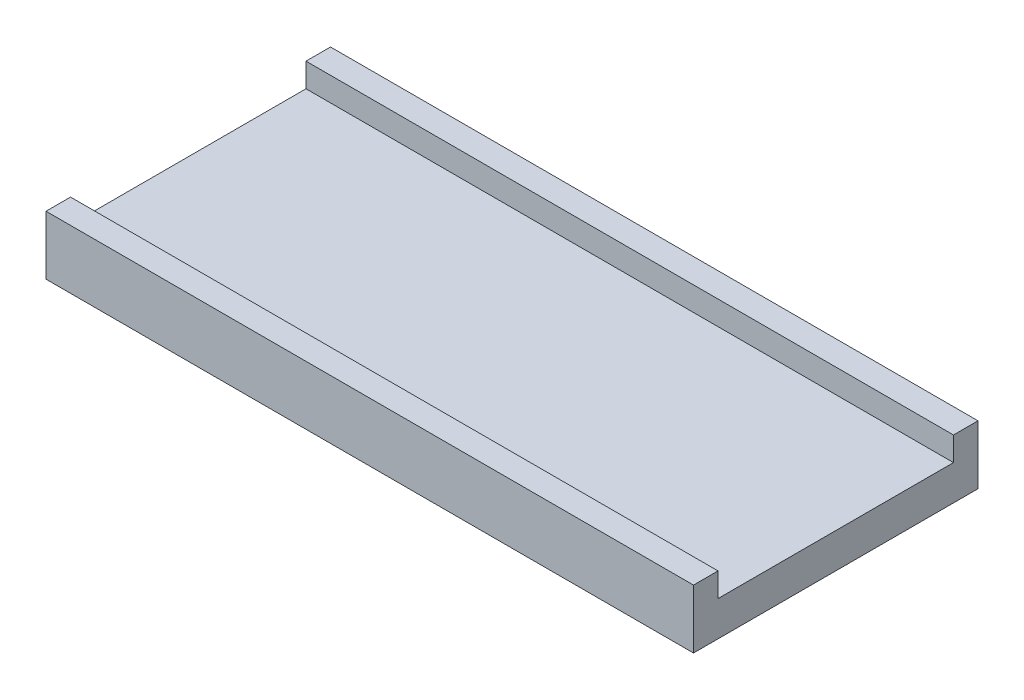
ISO-10303-21;
HEADER;
FILE_DESCRIPTION(('STEP AP214'),'2;1');
FILE_NAME('part.step','',(''),(''),'','','');
FILE_SCHEMA(('AUTOMOTIVE_DESIGN { 1 0 10303 214 1 1 1 1 }'));
ENDSEC;
DATA;
#1=APPLICATION_CONTEXT('core data for automotive mechanical design processes');
#2=APPLICATION_PROTOCOL_DEFINITION('international standard','automotive_design',2000,#1);
#3=PRODUCT_CONTEXT('',#1,'mechanical');
#4=PRODUCT('Part','Part','',(#3));
#5=PRODUCT_RELATED_PRODUCT_CATEGORY('part','',(#4));
#6=PRODUCT_DEFINITION_FORMATION('','',#4);
#7=PRODUCT_DEFINITION_CONTEXT('part definition',#1,'design');
#8=PRODUCT_DEFINITION('design','',#6,#7);
#9=PRODUCT_DEFINITION_SHAPE('','',#8);
#10=(LENGTH_UNIT() NAMED_UNIT(*) SI_UNIT(.MILLI.,.METRE.));
#11=(NAMED_UNIT(*) PLANE_ANGLE_UNIT() SI_UNIT($,.RADIAN.));
#12=(NAMED_UNIT(*) SI_UNIT($,.STERADIAN.) SOLID_ANGLE_UNIT());
#13=UNCERTAINTY_MEASURE_WITH_UNIT(LENGTH_MEASURE(1.E-05),#10,'distance_accuracy_value','');
#14=(GEOMETRIC_REPRESENTATION_CONTEXT(3) GLOBAL_UNCERTAINTY_ASSIGNED_CONTEXT((#13)) GLOBAL_UNIT_ASSIGNED_CONTEXT((#10,
#11,#12)) REPRESENTATION_CONTEXT('',''));
#15=CARTESIAN_POINT('',(0.,0.,0.));
#16=DIRECTION('',(0.,0.,1.));
#17=DIRECTION('',(1.,0.,0.));
#18=AXIS2_PLACEMENT_3D('',#15,#16,#17);
#19=CARTESIAN_POINT('',(0.,15.,0.));
#20=DIRECTION('',(0.,1.,0.));
#21=DIRECTION('',(0.,0.,1.));
#22=AXIS2_PLACEMENT_3D('',#19,#20,#21);
#23=PLANE('',#22);
#24=DIRECTION('',(-1.,0.,0.));
#25=VECTOR('',#24,1.);
#26=CARTESIAN_POINT('',(82.5,15.,-30.));
#27=LINE('',#26,#25);
#28=CARTESIAN_POINT('',(82.5,15.,-30.));
#29=VERTEX_POINT('',#28);
#30=CARTESIAN_POINT('',(-82.5,15.,-30.));
#31=VERTEX_POINT('',#30);
#32=EDGE_CURVE('E136',#29,#31,#27,.T.);
#33=ORIENTED_EDGE('',*,*,#32,.F.);
#34=DIRECTION('',(0.,0.,1.));
#35=VECTOR('',#34,1.);
#36=CARTESIAN_POINT('',(82.5,15.,-36.25));
#37=LINE('',#36,#35);
#38=CARTESIAN_POINT('',(82.5,15.,-36.25));
#39=VERTEX_POINT('',#38);
#40=EDGE_CURVE('E160',#39,#29,#37,.T.);
#41=ORIENTED_EDGE('',*,*,#40,.F.);
#42=DIRECTION('',(-1.,0.,0.));
#43=VECTOR('',#42,1.);
#44=CARTESIAN_POINT('',(82.5,15.,-36.25));
#45=LINE('',#44,#43);
#46=CARTESIAN_POINT('',(-82.5,15.,-36.25));
#47=VERTEX_POINT('',#46);
#48=EDGE_CURVE('E157',#39,#47,#45,.T.);
#49=ORIENTED_EDGE('',*,*,#48,.T.);
#50=DIRECTION('',(0.,0.,1.));
#51=VECTOR('',#50,1.);
#52=CARTESIAN_POINT('',(-82.5,15.,-36.25));
#53=LINE('',#52,#51);
#54=EDGE_CURVE('E153',#47,#31,#53,.T.);
#55=ORIENTED_EDGE('',*,*,#54,.T.);
#56=EDGE_LOOP('',(#33,#41,#49,#55));
#57=FACE_BOUND('',#56,.T.);
#58=ADVANCED_FACE('F45',(#57),#23,.T.);
#59=CARTESIAN_POINT('',(82.5,15.,36.25));
#60=DIRECTION('',(0.,0.,1.));
#61=DIRECTION('',(1.,0.,0.));
#62=AXIS2_PLACEMENT_3D('',#59,#60,#61);
#63=PLANE('',#62);
#64=DIRECTION('',(-1.,0.,0.));
#65=VECTOR('',#64,1.);
#66=CARTESIAN_POINT('',(82.5,0.,36.25));
#67=LINE('',#66,#65);
#68=CARTESIAN_POINT('',(82.5,0.,36.25));
#69=VERTEX_POINT('',#68);
#70=CARTESIAN_POINT('',(-82.5,0.,36.25));
#71=VERTEX_POINT('',#70);
#72=EDGE_CURVE('E164',#69,#71,#67,.T.);
#73=ORIENTED_EDGE('',*,*,#72,.F.);
#74=DIRECTION('',(0.,-1.,0.));
#75=VECTOR('',#74,1.);
#76=CARTESIAN_POINT('',(82.5,15.,36.25));
#77=LINE('',#76,#75);
#78=CARTESIAN_POINT('',(82.5,15.,36.25));
#79=VERTEX_POINT('',#78);
#80=EDGE_CURVE('E11',#79,#69,#77,.T.);
#81=ORIENTED_EDGE('',*,*,#80,.F.);
#82=DIRECTION('',(-1.,0.,0.));
#83=VECTOR('',#82,1.);
#84=CARTESIAN_POINT('',(82.5,15.,36.25));
#85=LINE('',#84,#83);
#86=CARTESIAN_POINT('',(-82.5,15.,36.25));
#87=VERTEX_POINT('',#86);
#88=EDGE_CURVE('E148',#79,#87,#85,.T.);
#89=ORIENTED_EDGE('',*,*,#88,.T.);
#90=DIRECTION('',(0.,-1.,0.));
#91=VECTOR('',#90,1.);
#92=CARTESIAN_POINT('',(-82.5,15.,36.25));
#93=LINE('',#92,#91);
#94=EDGE_CURVE('E49',#87,#71,#93,.T.);
#95=ORIENTED_EDGE('',*,*,#94,.T.);
#96=EDGE_LOOP('',(#73,#81,#89,#95));
#97=FACE_BOUND('',#96,.T.);
#98=ADVANCED_FACE('F47',(#97),#63,.T.);
#99=CARTESIAN_POINT('',(82.5,15.,-36.25));
#100=DIRECTION('',(1.,0.,0.));
#101=DIRECTION('',(0.,0.,-1.));
#102=AXIS2_PLACEMENT_3D('',#99,#100,#101);
#103=PLANE('',#102);
#104=DIRECTION('',(0.,1.,0.));
#105=VECTOR('',#104,1.);
#106=CARTESIAN_POINT('',(82.5,8.9,-30.));
#107=LINE('',#106,#105);
#108=CARTESIAN_POINT('',(82.5,8.9,-30.));
#109=VERTEX_POINT('',#108);
#110=EDGE_CURVE('E143',#109,#29,#107,.T.);
#111=ORIENTED_EDGE('',*,*,#110,.F.);
#112=DIRECTION('',(0.,0.,-1.));
#113=VECTOR('',#112,1.);
#114=CARTESIAN_POINT('',(82.5,8.9,30.));
#115=LINE('',#114,#113);
#116=CARTESIAN_POINT('',(82.5,8.9,30.));
#117=VERTEX_POINT('',#116);
#118=EDGE_CURVE('E125',#117,#109,#115,.T.);
#119=ORIENTED_EDGE('',*,*,#118,.F.);
#120=DIRECTION('',(0.,1.,0.));
#121=VECTOR('',#120,1.);
#122=CARTESIAN_POINT('',(82.5,8.9,30.));
#123=LINE('',#122,#121);
#124=CARTESIAN_POINT('',(82.5,15.,30.));
#125=VERTEX_POINT('',#124);
#126=EDGE_CURVE('E121',#117,#125,#123,.T.);
#127=ORIENTED_EDGE('',*,*,#126,.T.);
#128=EDGE_CURVE('E71',#125,#79,#37,.T.);
#129=ORIENTED_EDGE('',*,*,#128,.T.);
#130=ORIENTED_EDGE('',*,*,#80,.T.);
#131=DIRECTION('',(0.,0.,1.));
#132=VECTOR('',#131,1.);
#133=CARTESIAN_POINT('',(82.5,0.,-36.25));
#134=LINE('',#133,#132);
#135=CARTESIAN_POINT('',(82.5,0.,-36.25));
#136=VERTEX_POINT('',#135);
#137=EDGE_CURVE('E152',#136,#69,#134,.T.);
#138=ORIENTED_EDGE('',*,*,#137,.F.);
#139=DIRECTION('',(0.,-1.,0.));
#140=VECTOR('',#139,1.);
#141=CARTESIAN_POINT('',(82.5,15.,-36.25));
#142=LINE('',#141,#140);
#143=EDGE_CURVE('E55',#39,#136,#142,.T.);
#144=ORIENTED_EDGE('',*,*,#143,.F.);
#145=ORIENTED_EDGE('',*,*,#40,.T.);
#146=EDGE_LOOP('',(#111,#119,#127,#129,#130,#138,#144,#145));
#147=FACE_BOUND('',#146,.T.);
#148=ADVANCED_FACE('F192',(#147),#103,.T.);
#149=CARTESIAN_POINT('',(82.5,15.,-36.25));
#150=DIRECTION('',(0.,0.,1.));
#151=DIRECTION('',(1.,0.,0.));
#152=AXIS2_PLACEMENT_3D('',#149,#150,#151);
#153=PLANE('',#152);
#154=DIRECTION('',(-1.,0.,0.));
#155=VECTOR('',#154,1.);
#156=CARTESIAN_POINT('',(82.5,0.,-36.25));
#157=LINE('',#156,#155);
#158=CARTESIAN_POINT('',(-82.5,0.,-36.25));
#159=VERTEX_POINT('',#158);
#160=EDGE_CURVE('E173',#136,#159,#157,.T.);
#161=ORIENTED_EDGE('',*,*,#160,.T.);
#162=DIRECTION('',(0.,-1.,0.));
#163=VECTOR('',#162,1.);
#164=CARTESIAN_POINT('',(-82.5,15.,-36.25));
#165=LINE('',#164,#163);
#166=EDGE_CURVE('E180',#47,#159,#165,.T.);
#167=ORIENTED_EDGE('',*,*,#166,.F.);
#168=ORIENTED_EDGE('',*,*,#48,.F.);
#169=ORIENTED_EDGE('',*,*,#143,.T.);
#170=EDGE_LOOP('',(#161,#167,#168,#169));
#171=FACE_BOUND('',#170,.T.);
#172=ADVANCED_FACE('F196',(#171),#153,.F.);
#173=CARTESIAN_POINT('',(-82.5,15.,-36.25));
#174=DIRECTION('',(1.,0.,0.));
#175=DIRECTION('',(0.,0.,-1.));
#176=AXIS2_PLACEMENT_3D('',#173,#174,#175);
#177=PLANE('',#176);
#178=DIRECTION('',(0.,0.,1.));
#179=VECTOR('',#178,1.);
#180=CARTESIAN_POINT('',(-82.5,8.9,30.));
#181=LINE('',#180,#179);
#182=CARTESIAN_POINT('',(-82.5,8.9,-30.));
#183=VERTEX_POINT('',#182);
#184=CARTESIAN_POINT('',(-82.5,8.9,30.));
#185=VERTEX_POINT('',#184);
#186=EDGE_CURVE('E126',#183,#185,#181,.T.);
#187=ORIENTED_EDGE('',*,*,#186,.F.);
#188=DIRECTION('',(0.,1.,0.));
#189=VECTOR('',#188,1.);
#190=CARTESIAN_POINT('',(-82.5,8.9,-30.));
#191=LINE('',#190,#189);
#192=EDGE_CURVE('E169',#183,#31,#191,.T.);
#193=ORIENTED_EDGE('',*,*,#192,.T.);
#194=ORIENTED_EDGE('',*,*,#54,.F.);
#195=ORIENTED_EDGE('',*,*,#166,.T.);
#196=DIRECTION('',(0.,0.,1.));
#197=VECTOR('',#196,1.);
#198=CARTESIAN_POINT('',(-82.5,0.,-36.25));
#199=LINE('',#198,#197);
#200=EDGE_CURVE('E168',#159,#71,#199,.T.);
#201=ORIENTED_EDGE('',*,*,#200,.T.);
#202=ORIENTED_EDGE('',*,*,#94,.F.);
#203=CARTESIAN_POINT('',(-82.5,15.,30.));
#204=VERTEX_POINT('',#203);
#205=EDGE_CURVE('E96',#204,#87,#53,.T.);
#206=ORIENTED_EDGE('',*,*,#205,.F.);
#207=DIRECTION('',(0.,1.,0.));
#208=VECTOR('',#207,1.);
#209=CARTESIAN_POINT('',(-82.5,8.9,30.));
#210=LINE('',#209,#208);
#211=EDGE_CURVE('E63',#185,#204,#210,.T.);
#212=ORIENTED_EDGE('',*,*,#211,.F.);
#213=EDGE_LOOP('',(#187,#193,#194,#195,#201,#202,#206,#212));
#214=FACE_BOUND('',#213,.T.);
#215=ADVANCED_FACE('F138',(#214),#177,.F.);
#216=DIRECTION('',(1.,0.,0.));
#217=VECTOR('',#216,1.);
#218=CARTESIAN_POINT('',(82.5,15.,30.));
#219=LINE('',#218,#217);
#220=EDGE_CURVE('E201',#204,#125,#219,.T.);
#221=ORIENTED_EDGE('',*,*,#220,.F.);
#222=ORIENTED_EDGE('',*,*,#205,.T.);
#223=ORIENTED_EDGE('',*,*,#88,.F.);
#224=ORIENTED_EDGE('',*,*,#128,.F.);
#225=EDGE_LOOP('',(#221,#222,#223,#224));
#226=FACE_BOUND('',#225,.T.);
#227=ADVANCED_FACE('F211',(#226),#23,.T.);
#228=CARTESIAN_POINT('',(0.,0.,0.));
#229=DIRECTION('',(0.,1.,0.));
#230=DIRECTION('',(0.,0.,1.));
#231=AXIS2_PLACEMENT_3D('',#228,#229,#230);
#232=PLANE('',#231);
#233=ORIENTED_EDGE('',*,*,#72,.T.);
#234=ORIENTED_EDGE('',*,*,#200,.F.);
#235=ORIENTED_EDGE('',*,*,#160,.F.);
#236=ORIENTED_EDGE('',*,*,#137,.T.);
#237=EDGE_LOOP('',(#233,#234,#235,#236));
#238=FACE_BOUND('',#237,.T.);
#239=ADVANCED_FACE('F190',(#238),#232,.F.);
#240=CARTESIAN_POINT('',(82.5,8.9,-30.));
#241=DIRECTION('',(0.,0.,-1.));
#242=DIRECTION('',(-1.,0.,0.));
#243=AXIS2_PLACEMENT_3D('',#240,#241,#242);
#244=PLANE('',#243);
#245=ORIENTED_EDGE('',*,*,#32,.T.);
#246=ORIENTED_EDGE('',*,*,#192,.F.);
#247=DIRECTION('',(-1.,0.,0.));
#248=VECTOR('',#247,1.);
#249=CARTESIAN_POINT('',(82.5,8.9,-30.));
#250=LINE('',#249,#248);
#251=EDGE_CURVE('E132',#109,#183,#250,.T.);
#252=ORIENTED_EDGE('',*,*,#251,.F.);
#253=ORIENTED_EDGE('',*,*,#110,.T.);
#254=EDGE_LOOP('',(#245,#246,#252,#253));
#255=FACE_BOUND('',#254,.T.);
#256=ADVANCED_FACE('F208',(#255),#244,.F.);
#257=CARTESIAN_POINT('',(82.5,8.9,30.));
#258=DIRECTION('',(0.,0.,1.));
#259=DIRECTION('',(1.,0.,0.));
#260=AXIS2_PLACEMENT_3D('',#257,#258,#259);
#261=PLANE('',#260);
#262=ORIENTED_EDGE('',*,*,#220,.T.);
#263=ORIENTED_EDGE('',*,*,#126,.F.);
#264=DIRECTION('',(1.,0.,0.));
#265=VECTOR('',#264,1.);
#266=CARTESIAN_POINT('',(82.5,8.9,30.));
#267=LINE('',#266,#265);
#268=EDGE_CURVE('E118',#185,#117,#267,.T.);
#269=ORIENTED_EDGE('',*,*,#268,.F.);
#270=ORIENTED_EDGE('',*,*,#211,.T.);
#271=EDGE_LOOP('',(#262,#263,#269,#270));
#272=FACE_BOUND('',#271,.T.);
#273=ADVANCED_FACE('F120',(#272),#261,.F.);
#274=CARTESIAN_POINT('',(0.,8.9,0.));
#275=DIRECTION('',(0.,1.,0.));
#276=DIRECTION('',(0.,0.,1.));
#277=AXIS2_PLACEMENT_3D('',#274,#275,#276);
#278=PLANE('',#277);
#279=ORIENTED_EDGE('',*,*,#186,.T.);
#280=ORIENTED_EDGE('',*,*,#268,.T.);
#281=ORIENTED_EDGE('',*,*,#118,.T.);
#282=ORIENTED_EDGE('',*,*,#251,.T.);
#283=EDGE_LOOP('',(#279,#280,#281,#282));
#284=FACE_BOUND('',#283,.T.);
#285=ADVANCED_FACE('F130',(#284),#278,.T.);
#286=CLOSED_SHELL('',(#58,#98,#148,#172,#215,#227,#239,#256,#273,#285));
#287=MANIFOLD_SOLID_BREP('B2',#286);
#288=ADVANCED_BREP_SHAPE_REPRESENTATION('',(#18,#287),#14);
#289=SHAPE_DEFINITION_REPRESENTATION(#9,#288);
ENDSEC;
END-ISO-10303-21;
